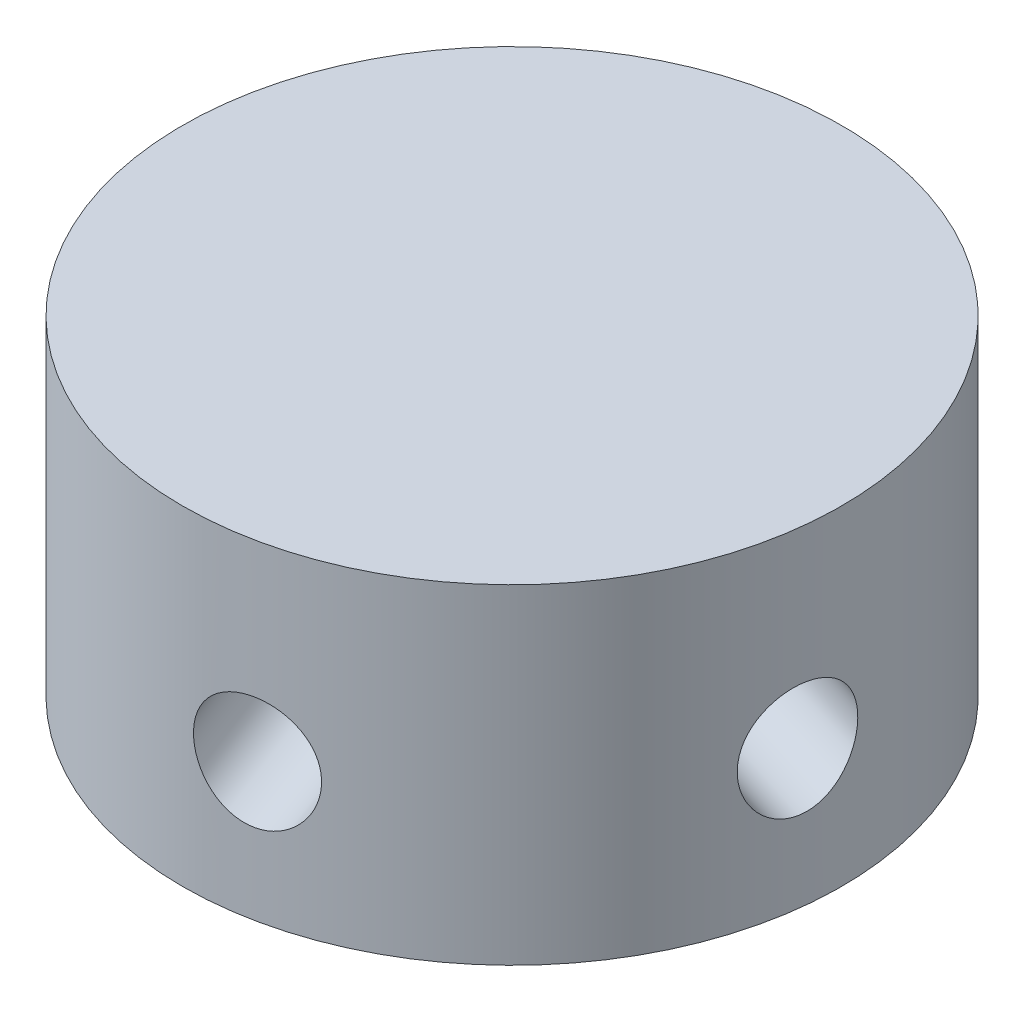
ISO-10303-21;
HEADER;
FILE_DESCRIPTION(('STEP AP214'),'2;1');
FILE_NAME('part.step','',(''),(''),'','','');
FILE_SCHEMA(('AUTOMOTIVE_DESIGN { 1 0 10303 214 1 1 1 1 }'));
ENDSEC;
DATA;
#1=APPLICATION_CONTEXT('core data for automotive mechanical design processes');
#2=APPLICATION_PROTOCOL_DEFINITION('international standard','automotive_design',2000,#1);
#3=PRODUCT_CONTEXT('',#1,'mechanical');
#4=PRODUCT('Part','Part','',(#3));
#5=PRODUCT_RELATED_PRODUCT_CATEGORY('part','',(#4));
#6=PRODUCT_DEFINITION_FORMATION('','',#4);
#7=PRODUCT_DEFINITION_CONTEXT('part definition',#1,'design');
#8=PRODUCT_DEFINITION('design','',#6,#7);
#9=PRODUCT_DEFINITION_SHAPE('','',#8);
#10=(LENGTH_UNIT() NAMED_UNIT(*) SI_UNIT(.MILLI.,.METRE.));
#11=(NAMED_UNIT(*) PLANE_ANGLE_UNIT() SI_UNIT($,.RADIAN.));
#12=(NAMED_UNIT(*) SI_UNIT($,.STERADIAN.) SOLID_ANGLE_UNIT());
#13=UNCERTAINTY_MEASURE_WITH_UNIT(LENGTH_MEASURE(1.E-05),#10,'distance_accuracy_value','');
#14=(GEOMETRIC_REPRESENTATION_CONTEXT(3) GLOBAL_UNCERTAINTY_ASSIGNED_CONTEXT((#13)) GLOBAL_UNIT_ASSIGNED_CONTEXT((#10,
#11,#12)) REPRESENTATION_CONTEXT('',''));
#15=CARTESIAN_POINT('',(0.,0.,0.));
#16=DIRECTION('',(0.,0.,1.));
#17=DIRECTION('',(1.,0.,0.));
#18=AXIS2_PLACEMENT_3D('',#15,#16,#17);
#19=CARTESIAN_POINT('',(0.,-7.,0.));
#20=DIRECTION('',(0.,1.,0.));
#21=DIRECTION('',(0.,0.,1.));
#22=AXIS2_PLACEMENT_3D('',#19,#20,#21);
#23=CYLINDRICAL_SURFACE('',#22,10.);
#24=CARTESIAN_POINT('',(-6.14049056453229,-2.80185333415317,-7.89267860912187));
#25=CARTESIAN_POINT('',(-6.14049484987098,-2.90311260530798,-7.8926771173948));
#26=CARTESIAN_POINT('',(-6.14742167349888,-3.00444630801447,-7.88730102143913));
#27=CARTESIAN_POINT('',(-6.17456960535942,-3.20428557507583,-7.86606467867558));
#28=CARTESIAN_POINT('',(-6.19481092788079,-3.30278660110905,-7.85018849025648));
#29=CARTESIAN_POINT('',(-6.24758606465871,-3.49402864719089,-7.80825195230282));
#30=CARTESIAN_POINT('',(-6.28010387497348,-3.58677698409684,-7.78220486030695));
#31=CARTESIAN_POINT('',(-6.35618053645921,-3.76405083087513,-7.72019225383376));
#32=CARTESIAN_POINT('',(-6.39973716809511,-3.84857798902742,-7.68422873308843));
#33=CARTESIAN_POINT('',(-6.49677419297166,-4.0074797372721,-7.60236653275902));
#34=CARTESIAN_POINT('',(-6.55032750757882,-4.08177226504704,-7.55639440638393));
#35=CARTESIAN_POINT('',(-6.66530484442865,-4.21673712753459,-7.45516985422077));
#36=CARTESIAN_POINT('',(-6.72672683044724,-4.27741297477979,-7.39991982818575));
#37=CARTESIAN_POINT('',(-6.85180731685719,-4.37969910254483,-7.28420196204808));
#38=CARTESIAN_POINT('',(-6.91517610130448,-4.42214746090229,-7.22416414907229));
#39=CARTESIAN_POINT('',(-7.04468208890332,-4.49037714811555,-7.09792925090644));
#40=CARTESIAN_POINT('',(-7.11081731209088,-4.51617018714301,-7.03173653070527));
#41=CARTESIAN_POINT('',(-7.23769609193848,-4.54827241317434,-6.9009669603053));
#42=CARTESIAN_POINT('',(-7.29842079861507,-4.55604960168239,-6.83672987422921));
#43=CARTESIAN_POINT('',(-7.4181232934973,-4.55610435520391,-6.70665707252628));
#44=CARTESIAN_POINT('',(-7.47710154986828,-4.54838611290343,-6.64082179409295));
#45=CARTESIAN_POINT('',(-7.58914518118781,-4.51849542512878,-6.51243718495664));
#46=CARTESIAN_POINT('',(-7.64235511011124,-4.49694768501525,-6.44986657890037));
#47=CARTESIAN_POINT('',(-7.74438908962325,-4.44093408992367,-6.3269915221727));
#48=CARTESIAN_POINT('',(-7.79321263189537,-4.4064667401441,-6.26668733461505));
#49=CARTESIAN_POINT('',(-7.88719536410919,-4.32455835210362,-6.1480141066026));
#50=CARTESIAN_POINT('',(-7.93217513840773,-4.27671851244057,-6.08977918037544));
#51=CARTESIAN_POINT('',(-8.01599488833277,-4.17027781305812,-5.97901830759517));
#52=CARTESIAN_POINT('',(-8.05483283696759,-4.11167341443825,-5.92649424758338));
#53=CARTESIAN_POINT('',(-8.12887873395592,-3.98039681645057,-5.82456968914417));
#54=CARTESIAN_POINT('',(-8.16355661281876,-3.90697856262923,-5.77574482124123));
#55=CARTESIAN_POINT('',(-8.22520624193827,-3.75167746614443,-5.68760774665095));
#56=CARTESIAN_POINT('',(-8.25217510749662,-3.66979147043527,-5.6482991017565));
#57=CARTESIAN_POINT('',(-8.29982334771064,-3.49389473062189,-5.57806967544514));
#58=CARTESIAN_POINT('',(-8.31995832537233,-3.39943899243557,-5.54789000950188));
#59=CARTESIAN_POINT('',(-8.35112569870438,-3.20580903167963,-5.50086365164089));
#60=CARTESIAN_POINT('',(-8.36215698226491,-3.10663423419308,-5.48401858869226));
#61=CARTESIAN_POINT('',(-8.3749751976751,-2.90510656540094,-5.4644245223265));
#62=CARTESIAN_POINT('',(-8.37665202559629,-2.80273004763596,-5.46184341196347));
#63=CARTESIAN_POINT('',(-8.3702179650445,-2.59900592417801,-5.47169881088784));
#64=CARTESIAN_POINT('',(-8.36210932299788,-2.49765808771846,-5.4841318734088));
#65=CARTESIAN_POINT('',(-8.33640829478898,-2.30289806320493,-5.52311622952816));
#66=CARTESIAN_POINT('',(-8.31917623870753,-2.20933107629193,-5.54913061701134));
#67=CARTESIAN_POINT('',(-8.27544405323076,-2.02912733106379,-5.61413850119806));
#68=CARTESIAN_POINT('',(-8.24894619094895,-1.94248888387195,-5.65312882289904));
#69=CARTESIAN_POINT('',(-8.18817869286306,-1.78234574650398,-5.74077006125955));
#70=CARTESIAN_POINT('',(-8.15427608455998,-1.70844589748726,-5.7889543827575));
#71=CARTESIAN_POINT('',(-8.07857486631454,-1.57180321214852,-5.89413382291653));
#72=CARTESIAN_POINT('',(-8.0367771178855,-1.5090591599609,-5.95112798013005));
#73=CARTESIAN_POINT('',(-7.94686706743979,-1.3976492449202,-6.07064896934821));
#74=CARTESIAN_POINT('',(-7.89889173560417,-1.34873573593262,-6.13304824928851));
#75=CARTESIAN_POINT('',(-7.79695939364072,-1.26473846475624,-6.26212247690848));
#76=CARTESIAN_POINT('',(-7.74300252241691,-1.229654381505,-6.32879732528523));
#77=CARTESIAN_POINT('',(-7.6304753269892,-1.1743255053056,-6.46402014793699));
#78=CARTESIAN_POINT('',(-7.57191849069269,-1.15403899904293,-6.53256228741066));
#79=CARTESIAN_POINT('',(-7.4515172201475,-1.12866503731343,-6.66957312480207));
#80=CARTESIAN_POINT('',(-7.38967276248538,-1.12357769010518,-6.73804182219324));
#81=CARTESIAN_POINT('',(-7.26433104139404,-1.12873521959118,-6.87298945856926));
#82=CARTESIAN_POINT('',(-7.20083212444676,-1.13899606231078,-6.93946625206363));
#83=CARTESIAN_POINT('',(-7.07414936240718,-1.17461642965421,-7.06856371471995));
#84=CARTESIAN_POINT('',(-7.01096551748161,-1.19997596226621,-7.13118438184174));
#85=CARTESIAN_POINT('',(-6.88696145187845,-1.26513227008347,-7.25101384908186));
#86=CARTESIAN_POINT('',(-6.82614108524058,-1.30492815217578,-7.30822298371172));
#87=CARTESIAN_POINT('',(-6.70896000255983,-1.39789330466096,-7.41594213852433));
#88=CARTESIAN_POINT('',(-6.65259901132912,-1.45106174898626,-7.46645257221381));
#89=CARTESIAN_POINT('',(-6.54642861262084,-1.56924203843328,-7.55971359766555));
#90=CARTESIAN_POINT('',(-6.49661184412477,-1.63424037731579,-7.60247292889534));
#91=CARTESIAN_POINT('',(-6.40528013313175,-1.77429957507827,-7.67958136416078));
#92=CARTESIAN_POINT('',(-6.36376672202771,-1.84936228587991,-7.71392891706904));
#93=CARTESIAN_POINT('',(-6.29041086863731,-2.00769020709796,-7.77386594225157));
#94=CARTESIAN_POINT('',(-6.25860722541265,-2.09098660894541,-7.79942032842891));
#95=CARTESIAN_POINT('',(-6.20598343870506,-2.26309586572625,-7.84135905208446));
#96=CARTESIAN_POINT('',(-6.18515318649743,-2.35190355902349,-7.85775183011779));
#97=CARTESIAN_POINT('',(-6.1602115596352,-2.50128545990081,-7.87730535840121));
#98=CARTESIAN_POINT('',(-6.15280973778735,-2.56100494517165,-7.88308144544808));
#99=CARTESIAN_POINT('',(-6.14294798907811,-2.68109191058814,-7.89076849470852));
#100=CARTESIAN_POINT('',(-6.14048800863267,-2.74145938370056,-7.89267949883093));
#101=CARTESIAN_POINT('',(-6.14049056453229,-2.80185333415317,-7.89267860912187));
#102=B_SPLINE_CURVE_WITH_KNOTS('',3,(#24,#25,#26,#27,#28,#29,#30,#31,#32,#33,#34,#35,#36,#37,
#38,#39,#40,#41,#42,#43,#44,#45,#46,#47,#48,#49,#50,#51,#52,#53,#54,#55,#56,#57,#58,#59,#60,#61,
#62,#63,#64,#65,#66,#67,#68,#69,#70,#71,#72,#73,#74,#75,#76,#77,#78,#79,#80,#81,#82,#83,#84,#85,
#86,#87,#88,#89,#90,#91,#92,#93,#94,#95,#96,#97,#98,#99,#100,#101),.UNSPECIFIED.,.T.,.F.,(4,2,2,
2,2,2,2,2,2,2,2,2,2,2,2,2,2,2,2,2,2,2,2,2,2,2,2,2,2,2,2,2,2,2,2,2,2,2,4),(0.,0.303551580729133,
0.607565085398305,0.911183631217716,1.21474117794247,1.52060630640841,1.82639244357147,
2.11601928881307,2.40544227824509,2.67029825789297,2.93508258362385,3.18867560467449,
3.44229797555118,3.70448486305142,3.96675810052679,4.24977540158885,4.53289846897012,
4.83504615345594,5.13723074292636,5.44296472274099,5.74862852930481,6.04303337870786,
6.33736624487386,6.6195178712115,6.90163872708666,7.17833137900766,7.45501760688407,
7.73092082959555,8.00682601746981,8.28301841666023,8.55921096197422,8.83538642339317,
9.11154482872539,9.38738989845224,9.66328579562635,9.94027013013495,10.2169988575706,
10.3980477403102,10.5790946599383),.UNSPECIFIED.);
#103=CARTESIAN_POINT('',(-6.14049056453229,-2.80185333415317,-7.89267860912187));
#104=VERTEX_POINT('',#103);
#105=EDGE_CURVE('E34',#104,#104,#102,.T.);
#106=ORIENTED_EDGE('',*,*,#105,.F.);
#107=EDGE_LOOP('',(#106));
#108=FACE_BOUND('',#107,.T.);
#109=CARTESIAN_POINT('',(5.60886748398926,-2.80185333415317,-8.27892538600561));
#110=CARTESIAN_POINT('',(5.60886474103002,-2.90311260530798,-8.27892900063588));
#111=CARTESIAN_POINT('',(5.6016112637211,-3.00444630801447,-8.28385549637072));
#112=CARTESIAN_POINT('',(5.5730251292465,-3.20428557507584,-8.30311232305832));
#113=CARTESIAN_POINT('',(5.55167106414886,-3.30278660110905,-8.31745695271329));
#114=CARTESIAN_POINT('',(5.49547863231234,-3.49402864719089,-8.35468998753138));
#115=CARTESIAN_POINT('',(5.460657819732,-3.58677698409685,-8.37756726884612));
#116=CARTESIAN_POINT('',(5.37817134497882,-3.76405083087514,-8.43075752422441));
#117=CARTESIAN_POINT('',(5.33050826483183,-3.84857798902742,-8.46106900348173));
#118=CARTESIAN_POINT('',(5.22266659599986,-4.0074797372721,-8.52805988721375));
#119=CARTESIAN_POINT('',(5.16239562132416,-4.08177226504703,-8.56478594772264));
#120=CARTESIAN_POINT('',(5.03059540032576,-4.21673712753459,-8.64285578629353));
#121=CARTESIAN_POINT('',(4.95906906553167,-4.27741297477979,-8.68419836935582));
#122=CARTESIAN_POINT('',(4.81036283892431,-4.37969910254483,-8.76739819382802));
#123=CARTESIAN_POINT('',(4.73368145436248,-4.42214746090229,-8.8091127846917));
#124=CARTESIAN_POINT('',(4.57360538083664,-4.49037714811555,-8.89327156928038));
#125=CARTESIAN_POINT('',(4.49021545506629,-4.51617018714301,-8.93571522880347));
#126=CARTESIAN_POINT('',(4.32663850380581,-4.54827241317434,-9.01597409955641));
#127=CARTESIAN_POINT('',(4.24678043816383,-4.55604960168239,-9.05387637627465));
#128=CARTESIAN_POINT('',(4.0860837473238,-4.55610435520391,-9.12752550781701));
#129=CARTESIAN_POINT('',(4.00524539325044,-4.54838611290343,-9.16327294299305));
#130=CARTESIAN_POINT('',(3.84852098795013,-4.51849542512878,-9.23015974262957));
#131=CARTESIAN_POINT('',(3.77257003302495,-4.49694768501525,-9.26143001164407));
#132=CARTESIAN_POINT('',(3.62417867596105,-4.44093408992367,-9.32049961202886));
#133=CARTESIAN_POINT('',(3.55173868113679,-4.4064667401441,-9.34829854126808));
#134=CARTESIAN_POINT('',(3.40983147289392,-4.32455835210362,-9.40100938692608));
#135=CARTESIAN_POINT('',(3.34054725216821,-4.27671851244057,-9.42579211250382));
#136=CARTESIAN_POINT('',(3.2093056751689,-4.17027781305812,-9.47128243986336));
#137=CARTESIAN_POINT('',(3.14735073947758,-4.11167341443825,-9.49198869683483));
#138=CARTESIAN_POINT('',(3.02753328347034,-3.98039681645057,-9.53091410896862));
#139=CARTESIAN_POINT('',(2.9703820207965,-3.90697856262923,-9.54880701770229));
#140=CARTESIAN_POINT('',(2.86750789858538,-3.75167746614443,-9.5802034453207));
#141=CARTESIAN_POINT('',(2.82178931793524,-3.66979147043527,-9.59370532134882));
#142=CARTESIAN_POINT('',(2.74027304842797,-3.49389473062189,-9.61731940445895));
#143=CARTESIAN_POINT('',(2.70534843019419,-3.39943899243557,-9.62714287650853));
#144=CARTESIAN_POINT('',(2.65099245808324,-3.20580903167963,-9.64225286624917));
#145=CARTESIAN_POINT('',(2.63156299710857,-3.10663423419308,-9.64753882964007));
#146=CARTESIAN_POINT('',(2.60896688621138,-2.90510656540094,-9.65367477743728));
#147=CARTESIAN_POINT('',(2.60599393605706,-2.80273004763597,-9.6544719285919));
#148=CARTESIAN_POINT('',(2.61735521147811,-2.59900592417802,-9.65139825913186));
#149=CARTESIAN_POINT('',(2.63168546479988,-2.49765808771846,-9.64752850988622));
#150=CARTESIAN_POINT('',(2.67670384521024,-2.30289806320494,-9.63513220808831));
#151=CARTESIAN_POINT('',(2.70676999612073,-2.20933107629194,-9.62678243669344));
#152=CARTESIAN_POINT('',(2.78211015650055,-2.02912733106379,-9.60527919770599));
#153=CARTESIAN_POINT('',(2.8273804457864,-1.94248888387195,-9.59212690513672));
#154=CARTESIAN_POINT('',(2.92951040623952,-1.78234574650398,-9.56141621216465));
#155=CARTESIAN_POINT('',(2.98581290130269,-1.70844589748726,-9.54406268982389));
#156=CARTESIAN_POINT('',(3.10923745617895,-1.57180321214852,-9.50456878738806));
#157=CARTESIAN_POINT('',(3.17635833537879,-1.5090591599609,-9.48242892953723));
#158=CARTESIAN_POINT('',(3.3178132845616,-1.3976492449202,-9.43385340703332));
#159=CARTESIAN_POINT('',(3.39198371920893,-1.34873573593262,-9.40750859300794));
#160=CARTESIAN_POINT('',(3.54623943041581,-1.26473846475624,-9.35045130483276));
#161=CARTESIAN_POINT('',(3.62632456960897,-1.229654381505,-9.31973893210225));
#162=CARTESIAN_POINT('',(3.78970193196027,-1.1743255053056,-9.25450535985705));
#163=CARTESIAN_POINT('',(3.87298443789996,-1.15403899904293,-9.21999518505181));
#164=CARTESIAN_POINT('',(4.04049552634692,-1.12866503731343,-9.14782544929708));
#165=CARTESIAN_POINT('',(4.12472411558854,-1.12357769010518,-9.11016586591736));
#166=CARTESIAN_POINT('',(4.291799666444,-1.12873521959118,-9.03265991830073));
#167=CARTESIAN_POINT('',(4.37464509854034,-1.13899606231078,-8.99281131848163));
#168=CARTESIAN_POINT('',(4.53657120800139,-1.17461642965421,-8.91222216203311));
#169=CARTESIAN_POINT('',(4.61565188337428,-1.19997596226621,-8.87148160493179));
#170=CARTESIAN_POINT('',(4.76793584268013,-1.26513227008347,-8.79057607209691));
#171=CARTESIAN_POINT('',(4.84113948985668,-1.30492815217578,-8.75041106091663));
#172=CARTESIAN_POINT('',(4.97979743993862,-1.39789330466096,-8.67225227810337));
#173=CARTESIAN_POINT('',(5.04525222115,-1.45106174898626,-8.63425837253185));
#174=CARTESIAN_POINT('',(5.16675718462268,-1.56924203843328,-8.56210356478011));
#175=CARTESIAN_POINT('',(5.22281795329132,-1.63424037731579,-8.52793836249927));
#176=CARTESIAN_POINT('',(5.32437548393402,-1.77429957507827,-8.46490456052165));
#177=CARTESIAN_POINT('',(5.36987029747184,-1.84936228587991,-8.43603693794135));
#178=CARTESIAN_POINT('',(5.44954200117354,-2.00769020709796,-8.3847929349397));
#179=CARTESIAN_POINT('',(5.48367353290688,-2.09098660894541,-8.36244261241858));
#180=CARTESIAN_POINT('',(5.5398212737256,-2.26309586572625,-8.32535419549017));
#181=CARTESIAN_POINT('',(5.56184863402365,-2.3519035590235,-8.31060909538934));
#182=CARTESIAN_POINT('',(5.58815253108195,-2.50128545990081,-8.29293057117458));
#183=CARTESIAN_POINT('',(5.59593320504688,-2.56100494517165,-8.2876759293322));
#184=CARTESIAN_POINT('',(5.60629147128251,-2.68109191058814,-8.28067227781828));
#185=CARTESIAN_POINT('',(5.60886911996927,-2.74145938370056,-8.27892323013583));
#186=CARTESIAN_POINT('',(5.60886748398926,-2.80185333415317,-8.27892538600561));
#187=B_SPLINE_CURVE_WITH_KNOTS('',3,(#109,#110,#111,#112,#113,#114,#115,#116,#117,#118,#119,
#120,#121,#122,#123,#124,#125,#126,#127,#128,#129,#130,#131,#132,#133,#134,#135,#136,#137,#138,
#139,#140,#141,#142,#143,#144,#145,#146,#147,#148,#149,#150,#151,#152,#153,#154,#155,#156,#157,
#158,#159,#160,#161,#162,#163,#164,#165,#166,#167,#168,#169,#170,#171,#172,#173,#174,#175,#176,
#177,#178,#179,#180,#181,#182,#183,#184,#185,#186),.UNSPECIFIED.,.T.,.F.,(4,2,2,2,2,2,2,2,2,2,2,
2,2,2,2,2,2,2,2,2,2,2,2,2,2,2,2,2,2,2,2,2,2,2,2,2,2,2,4),(0.,0.303551580729133,
0.607565085398305,0.911183631217717,1.21474117794247,1.52060630640841,1.82639244357147,
2.11601928881307,2.40544227824509,2.67029825789297,2.93508258362385,3.18867560467449,
3.44229797555118,3.70448486305142,3.96675810052679,4.24977540158885,4.53289846897012,
4.83504615345594,5.13723074292636,5.44296472274099,5.74862852930481,6.04303337870786,
6.33736624487386,6.6195178712115,6.90163872708666,7.17833137900766,7.45501760688407,
7.73092082959556,8.00682601746981,8.28301841666023,8.55921096197422,8.83538642339317,
9.11154482872539,9.38738989845224,9.66328579562635,9.94027013013495,10.2169988575706,
10.3980477403102,10.5790946599383),.UNSPECIFIED.);
#188=CARTESIAN_POINT('',(5.60886748398926,-2.80185333415317,-8.27892538600561));
#189=VERTEX_POINT('',#188);
#190=EDGE_CURVE('E89',#189,#189,#187,.T.);
#191=ORIENTED_EDGE('',*,*,#190,.F.);
#192=EDGE_LOOP('',(#191));
#193=FACE_BOUND('',#192,.T.);
#194=CARTESIAN_POINT('',(9.92716226766536,-4.55517624671581,1.20476110139782));
#195=CARTESIAN_POINT('',(9.93759733292305,-4.55815622649319,1.11876470154856));
#196=CARTESIAN_POINT('',(9.94694247296546,-4.55369712601266,1.03232700667402));
#197=CARTESIAN_POINT('',(9.96321903376517,-4.53008356025253,0.861206414228923));
#198=CARTESIAN_POINT('',(9.97014816779366,-4.51091522742824,0.776525250096444));
#199=CARTESIAN_POINT('',(9.98162255807638,-4.45882309306678,0.61158314561609));
#200=CARTESIAN_POINT('',(9.98617353195352,-4.42593262849761,0.531312022651404));
#201=CARTESIAN_POINT('',(9.99319024522215,-4.34774705512916,0.376995777821501));
#202=CARTESIAN_POINT('',(9.99565589465482,-4.30245141129443,0.30295092467541));
#203=CARTESIAN_POINT('',(9.99898921032584,-4.19897933879916,0.159840225874142));
#204=CARTESIAN_POINT('',(9.99978828840905,-4.14035642897913,0.0910964174944591));
#205=CARTESIAN_POINT('',(10.0001373349712,-4.0132348009273,-0.0365522496687653));
#206=CARTESIAN_POINT('',(9.99968687777297,-3.94473272471153,-0.0954537482413401));
#207=CARTESIAN_POINT('',(9.9980310340233,-3.79372225422006,-0.206702876823501));
#208=CARTESIAN_POINT('',(9.9967667841341,-3.71052599866569,-0.25811732147479));
#209=CARTESIAN_POINT('',(9.99407696634846,-3.53697847646171,-0.346999318196151));
#210=CARTESIAN_POINT('',(9.99265134622098,-3.4466248960425,-0.384462337650199));
#211=CARTESIAN_POINT('',(9.99010488200058,-3.25669631917349,-0.445872771632775));
#212=CARTESIAN_POINT('',(9.98900151976161,-3.15688749367757,-0.469101879100419));
#213=CARTESIAN_POINT('',(9.98758943790602,-2.95475738874918,-0.498272771841489));
#214=CARTESIAN_POINT('',(9.98728067771086,-2.85243623788491,-0.504215439896358));
#215=CARTESIAN_POINT('',(9.9875791897699,-2.64958431456438,-0.498268108615026));
#216=CARTESIAN_POINT('',(9.98817497287104,-2.54904722451843,-0.486601782726115));
#217=CARTESIAN_POINT('',(9.9900807702515,-2.35159822781051,-0.445759466697659));
#218=CARTESIAN_POINT('',(9.99139058669743,-2.25468532495845,-0.416588326297531));
#219=CARTESIAN_POINT('',(9.99418066476258,-2.07181493275742,-0.342981087338452));
#220=CARTESIAN_POINT('',(9.99565083083889,-1.98556252239806,-0.299276874136405));
#221=CARTESIAN_POINT('',(9.99817796262187,-1.82197399796506,-0.197523092692519));
#222=CARTESIAN_POINT('',(9.99923500583166,-1.74463621340172,-0.13947621851604));
#223=CARTESIAN_POINT('',(10.0001846941871,-1.60367921453023,-0.0128951213293563));
#224=CARTESIAN_POINT('',(10.0001147903363,-1.53969011724363,0.0552274891447694));
#225=CARTESIAN_POINT('',(9.99824017956867,-1.42414388208328,0.201284705157195));
#226=CARTESIAN_POINT('',(9.9964355858994,-1.37258593292874,0.279218669881971));
#227=CARTESIAN_POINT('',(9.99056696460379,-1.28381972761827,0.441704325047936));
#228=CARTESIAN_POINT('',(9.9865272676749,-1.24646413154236,0.526176470084306));
#229=CARTESIAN_POINT('',(9.97584956992457,-1.18631756581786,0.700000921190993));
#230=CARTESIAN_POINT('',(9.96921158088991,-1.1635265301005,0.789353205121687));
#231=CARTESIAN_POINT('',(9.95322346211486,-1.13310117923188,0.970357554567299));
#232=CARTESIAN_POINT('',(9.94387355223949,-1.12546563576461,1.06200943309589));
#233=CARTESIAN_POINT('',(9.92262227910084,-1.12554227700687,1.24501102267329));
#234=CARTESIAN_POINT('',(9.91072090097041,-1.13325455114871,1.33636073195823));
#235=CARTESIAN_POINT('',(9.88479880609176,-1.16384229749555,1.51625202428275));
#236=CARTESIAN_POINT('',(9.8707764168677,-1.1867297843942,1.6047913239827));
#237=CARTESIAN_POINT('',(9.84132271627415,-1.24708623784334,1.77650247665508));
#238=CARTESIAN_POINT('',(9.82589142133141,-1.28455503440369,1.85967439218775));
#239=CARTESIAN_POINT('',(9.79454290653,-1.3730472522044,2.01828341795896));
#240=CARTESIAN_POINT('',(9.77862604187545,-1.42406096597627,2.09372601424868));
#241=CARTESIAN_POINT('',(9.74733520696948,-1.53825805250186,2.23488084183876));
#242=CARTESIAN_POINT('',(9.7319612177713,-1.60144100004235,2.30059341298047));
#243=CARTESIAN_POINT('',(9.70282411676594,-1.73817942133627,2.42054193721004));
#244=CARTESIAN_POINT('',(9.6890605724322,-1.81173209827547,2.47478097498792));
#245=CARTESIAN_POINT('',(9.66411346237586,-1.96711260425739,2.57047965212234));
#246=CARTESIAN_POINT('',(9.65292991193587,-2.04894048231417,2.61193921578009));
#247=CARTESIAN_POINT('',(9.63383395446498,-2.21929169893551,2.68152277071237));
#248=CARTESIAN_POINT('',(9.62595159290607,-2.30786821561446,2.70952460301551));
#249=CARTESIAN_POINT('',(9.61411462997497,-2.48857010245244,2.7512310000393));
#250=CARTESIAN_POINT('',(9.61016056846264,-2.58069595858475,2.76493359965276));
#251=CARTESIAN_POINT('',(9.60632286199532,-2.76875264868655,2.77823920657476));
#252=CARTESIAN_POINT('',(9.60656197419399,-2.86471584250245,2.77741698787133));
#253=CARTESIAN_POINT('',(9.61129453203855,-3.05526117304809,2.76099355196606));
#254=CARTESIAN_POINT('',(9.61578900989037,-3.14984296904566,2.74538874901524));
#255=CARTESIAN_POINT('',(9.62891948662646,-3.33935657690068,2.69898411435998));
#256=CARTESIAN_POINT('',(9.63772932473139,-3.43412001087822,2.66754475516235));
#257=CARTESIAN_POINT('',(9.65885023979024,-3.61705672125594,2.59002284863815));
#258=CARTESIAN_POINT('',(9.67116214767477,-3.70522842736983,2.54393682581586));
#259=CARTESIAN_POINT('',(9.69871877776086,-3.87456105535657,2.4367975014589));
#260=CARTESIAN_POINT('',(9.7140275741255,-3.95549917871989,2.37540728946565));
#261=CARTESIAN_POINT('',(9.74624901136707,-4.10521606951835,2.23952881163659));
#262=CARTESIAN_POINT('',(9.7631617944611,-4.17399375719983,2.16503938386075));
#263=CARTESIAN_POINT('',(9.79675229921839,-4.29453548271792,2.00746213623223));
#264=CARTESIAN_POINT('',(9.81341808633477,-4.34680349059918,1.92475834861463));
#265=CARTESIAN_POINT('',(9.84590184293491,-4.43501128395859,1.75099193526312));
#266=CARTESIAN_POINT('',(9.86172133776395,-4.47098138356953,1.65994520995519));
#267=CARTESIAN_POINT('',(9.88589211006985,-4.51470673753603,1.50754479884505));
#268=CARTESIAN_POINT('',(9.89482419372251,-4.52798285176991,1.44781711468795));
#269=CARTESIAN_POINT('',(9.91174257590944,-4.54715592642268,1.32705455818726));
#270=CARTESIAN_POINT('',(9.91972895136604,-4.5530534873747,1.26601979263704));
#271=CARTESIAN_POINT('',(9.92716226766536,-4.55517624671581,1.20476110139782));
#272=B_SPLINE_CURVE_WITH_KNOTS('',3,(#194,#195,#196,#197,#198,#199,#200,#201,#202,#203,#204,
#205,#206,#207,#208,#209,#210,#211,#212,#213,#214,#215,#216,#217,#218,#219,#220,#221,#222,#223,
#224,#225,#226,#227,#228,#229,#230,#231,#232,#233,#234,#235,#236,#237,#238,#239,#240,#241,#242,
#243,#244,#245,#246,#247,#248,#249,#250,#251,#252,#253,#254,#255,#256,#257,#258,#259,#260,#261,
#262,#263,#264,#265,#266,#267,#268,#269,#270,#271),.UNSPECIFIED.,.T.,.F.,(4,2,2,2,2,2,2,2,2,2,2,
2,2,2,2,2,2,2,2,2,2,2,2,2,2,2,2,2,2,2,2,2,2,2,2,2,2,2,4),(0.,0.259799683229375,
0.519844601333052,0.779261403602595,1.03868939628262,1.30859904487898,1.57860065445836,
1.87073764071155,2.162969455412,2.46894161662314,2.77489815221688,3.07700092801512,
3.37902004433016,3.66768679633482,3.95629936755057,4.23534105186774,4.51436452045223,
4.79040873398835,5.0664516953045,5.34247228309215,5.61849447926699,5.89473547227449,
6.17097324493736,6.44701357342665,6.72304425835819,6.999000637119,7.2749586504666,
7.55337638350161,7.83183237374117,8.11845355974561,8.4051442880468,8.70447341168249,
9.00387361599764,9.31055910111332,9.61727180389319,9.91343136064924,10.2090377758234,
10.3941185943434,10.5791843483389),.UNSPECIFIED.);
#273=CARTESIAN_POINT('',(9.92716226766536,-4.55517624671581,1.20476110139782));
#274=VERTEX_POINT('',#273);
#275=EDGE_CURVE('E93',#274,#274,#272,.T.);
#276=ORIENTED_EDGE('',*,*,#275,.F.);
#277=EDGE_LOOP('',(#276));
#278=FACE_BOUND('',#277,.T.);
#279=CARTESIAN_POINT('',(1.88425206211219,-1.12797580944576,9.82087542770124));
#280=CARTESIAN_POINT('',(1.79397796352734,-1.13299817941267,9.83819399668988));
#281=CARTESIAN_POINT('',(1.7038209740874,-1.14567644738588,9.85418955752939));
#282=CARTESIAN_POINT('',(1.52637593194951,-1.18604733135926,9.8832324623693));
#283=CARTESIAN_POINT('',(1.43909074461173,-1.21375448783806,9.89627693383675));
#284=CARTESIAN_POINT('',(1.27002899329948,-1.28345606009991,9.91939035861277));
#285=CARTESIAN_POINT('',(1.18825060997918,-1.32544572918644,9.92946029841206));
#286=CARTESIAN_POINT('',(1.03262303908419,-1.42257904933871,9.94685023024041));
#287=CARTESIAN_POINT('',(0.958772056787999,-1.4777197139426,9.95417084564366));
#288=CARTESIAN_POINT('',(0.821218013151381,-1.59959448866735,9.9664625614339));
#289=CARTESIAN_POINT('',(0.757508056143502,-1.66632065580148,9.97143526291232));
#290=CARTESIAN_POINT('',(0.642026134066624,-1.80950033773246,9.97953724642271));
#291=CARTESIAN_POINT('',(0.590254312345219,-1.88595396931509,9.98266650632018));
#292=CARTESIAN_POINT('',(0.499857369153589,-2.04674602405465,9.98760281190504));
#293=CARTESIAN_POINT('',(0.461290691081435,-2.13111744565325,9.98940401939627));
#294=CARTESIAN_POINT('',(0.398517854253216,-2.30504750229437,9.99210566539118));
#295=CARTESIAN_POINT('',(0.374312932696487,-2.39460658350069,9.99300602629566));
#296=CARTESIAN_POINT('',(0.340275298813555,-2.5784264919362,9.99422399629749));
#297=CARTESIAN_POINT('',(0.330766767663928,-2.67274722215466,9.99452849916559));
#298=CARTESIAN_POINT('',(0.327037980106658,-2.86168568913454,9.99465089673687));
#299=CARTESIAN_POINT('',(0.332820986209969,-2.95630348497445,9.99446868759799));
#300=CARTESIAN_POINT('',(0.359754766671757,-3.14733551041188,9.99353619372746));
#301=CARTESIAN_POINT('',(0.381534220879904,-3.24366097928055,9.99276261508605));
#302=CARTESIAN_POINT('',(0.440343669179684,-3.43153889298823,9.99034316782993));
#303=CARTESIAN_POINT('',(0.477377889685958,-3.52309000714111,9.98869705743934));
#304=CARTESIAN_POINT('',(0.567278258663954,-3.70222471606751,9.98400170384322));
#305=CARTESIAN_POINT('',(0.620669383153185,-3.78954439896984,9.98090378614786));
#306=CARTESIAN_POINT('',(0.741387612834615,-3.95388315381892,9.972662329664));
#307=CARTESIAN_POINT('',(0.808715753351292,-4.03090145981802,9.96751863887714));
#308=CARTESIAN_POINT('',(0.954726680874589,-4.1710919252199,9.95458646748242));
#309=CARTESIAN_POINT('',(1.03325845796322,-4.23442380612059,9.94683154334535));
#310=CARTESIAN_POINT('',(1.20016515913998,-4.34581070807782,9.92807270753976));
#311=CARTESIAN_POINT('',(1.28853449306495,-4.39387434603178,9.91707063524359));
#312=CARTESIAN_POINT('',(1.46562813631754,-4.46949564329076,9.89238756709442));
#313=CARTESIAN_POINT('',(1.55385824067059,-4.49829142810565,9.87895991239162));
#314=CARTESIAN_POINT('',(1.73358206426232,-4.53925733510558,9.84900846431078));
#315=CARTESIAN_POINT('',(1.82507384017884,-4.551437192731,9.83248649038561));
#316=CARTESIAN_POINT('',(2.00112822858455,-4.55825554910374,9.79810766310484));
#317=CARTESIAN_POINT('',(2.08568295193661,-4.55417028222142,9.78045100097735));
#318=CARTESIAN_POINT('',(2.2524214623541,-4.53149488706399,9.74340236078445));
#319=CARTESIAN_POINT('',(2.33460546600626,-4.51290608819781,9.72401054190953));
#320=CARTESIAN_POINT('',(2.49331152197482,-4.46240569049193,9.68452413797268));
#321=CARTESIAN_POINT('',(2.56989355090651,-4.43067145104624,9.66444205548597));
#322=CARTESIAN_POINT('',(2.7168238368601,-4.35516040206012,9.62417166523441));
#323=CARTESIAN_POINT('',(2.78717077645522,-4.31138105546237,9.60398333597051));
#324=CARTESIAN_POINT('',(2.92408418288135,-4.21045875073771,9.56321737660709));
#325=CARTESIAN_POINT('',(2.99020561261263,-4.15269560196409,9.54268330920858));
#326=CARTESIAN_POINT('',(3.11281411310429,-4.02720431691575,9.50339634605955));
#327=CARTESIAN_POINT('',(3.16929757332565,-3.9594724638236,9.48464411897582));
#328=CARTESIAN_POINT('',(3.27592351694458,-3.81000081064346,9.44837322131307));
#329=CARTESIAN_POINT('',(3.32517424978051,-3.7275692960801,9.43107958288188));
#330=CARTESIAN_POINT('',(3.4104817859734,-3.55543289944692,9.40056765711808));
#331=CARTESIAN_POINT('',(3.44653442682943,-3.46572573361221,9.38735065570861));
#332=CARTESIAN_POINT('',(3.50609912444722,-3.27679773906975,9.36527289189275));
#333=CARTESIAN_POINT('',(3.52891103691489,-3.17732616882531,9.35665700041914));
#334=CARTESIAN_POINT('',(3.55840495265489,-2.97567515645113,9.34548063325825));
#335=CARTESIAN_POINT('',(3.56508744855359,-2.87349579711934,9.34291997263151));
#336=CARTESIAN_POINT('',(3.56180406152239,-2.67052196990983,9.34417229402892));
#337=CARTESIAN_POINT('',(3.55201642263741,-2.56972442482577,9.34791703761687));
#338=CARTESIAN_POINT('',(3.51596163067956,-2.37154506419716,9.36153742454118));
#339=CARTESIAN_POINT('',(3.48969902833879,-2.2741623132552,9.3714113748536));
#340=CARTESIAN_POINT('',(3.42256687290569,-2.09015205385105,9.39612932250519));
#341=CARTESIAN_POINT('',(3.38238939580159,-2.00324003894115,9.41073603060885));
#342=CARTESIAN_POINT('',(3.28814380823967,-1.83818429601899,9.44407732861052));
#343=CARTESIAN_POINT('',(3.23407880116544,-1.76003861463188,9.46281099614256));
#344=CARTESIAN_POINT('',(3.11549480108507,-1.61744050813242,9.5024973472681));
#345=CARTESIAN_POINT('',(3.05139414177375,-1.55261261217993,9.52335282955628));
#346=CARTESIAN_POINT('',(2.9131679218755,-1.43527833961059,9.56653976803455));
#347=CARTESIAN_POINT('',(2.83904104192768,-1.38277358710046,9.58887141827704));
#348=CARTESIAN_POINT('',(2.68365531117102,-1.2920740764786,9.63350683839952));
#349=CARTESIAN_POINT('',(2.60248313343967,-1.25372938554753,9.65580825225482));
#350=CARTESIAN_POINT('',(2.43458312517793,-1.19159565912095,9.69950015547053));
#351=CARTESIAN_POINT('',(2.34786081338182,-1.16779240544502,9.72089151554759));
#352=CARTESIAN_POINT('',(2.19800432674179,-1.14021889639142,9.75565446030613));
#353=CARTESIAN_POINT('',(2.13566406096635,-1.1325680386452,9.76949565955588));
#354=CARTESIAN_POINT('',(2.01028088212708,-1.12469438471043,9.7960644021668));
#355=CARTESIAN_POINT('',(1.94723796710681,-1.12447160920956,9.80879194242626));
#356=CARTESIAN_POINT('',(1.88425206211219,-1.12797580944576,9.82087542770124));
#357=B_SPLINE_CURVE_WITH_KNOTS('',3,(#279,#280,#281,#282,#283,#284,#285,#286,#287,#288,#289,
#290,#291,#292,#293,#294,#295,#296,#297,#298,#299,#300,#301,#302,#303,#304,#305,#306,#307,#308,
#309,#310,#311,#312,#313,#314,#315,#316,#317,#318,#319,#320,#321,#322,#323,#324,#325,#326,#327,
#328,#329,#330,#331,#332,#333,#334,#335,#336,#337,#338,#339,#340,#341,#342,#343,#344,#345,#346,
#347,#348,#349,#350,#351,#352,#353,#354,#355,#356),.UNSPECIFIED.,.T.,.F.,(4,2,2,2,2,2,2,2,2,2,2,
2,2,2,2,2,2,2,2,2,2,2,2,2,2,2,2,2,2,2,2,2,2,2,2,2,2,2,4),(0.,0.27593969888326,0.55214684739258,
0.828262289868468,1.10431508884445,1.38017936881391,1.65604696106128,1.93312016845874,
2.21021724097585,2.49334360325347,2.77653037655254,3.07148608785842,3.36652357324658,
3.67225019633702,3.97799953877569,4.27996087779385,4.5817514956833,4.86157131298817,
5.14122711050627,5.39938932116727,5.6575278711892,5.91229152278962,6.16710887631643,
6.43647225055479,6.70593631217485,6.99735794562805,7.28887141052765,7.59465258889899,
7.90042442795053,8.20290836347253,8.50530878332492,8.79442993950001,9.08348654319853,
9.36270706065679,9.64196435684765,9.91817367630635,10.1941124925202,10.3866401779295,
10.5791683995407),.UNSPECIFIED.);
#358=CARTESIAN_POINT('',(1.88425206211219,-1.12797580944576,9.82087542770124));
#359=VERTEX_POINT('',#358);
#360=EDGE_CURVE('E58',#359,#359,#357,.T.);
#361=ORIENTED_EDGE('',*,*,#360,.F.);
#362=EDGE_LOOP('',(#361));
#363=FACE_BOUND('',#362,.T.);
#364=CARTESIAN_POINT('',(-9.40389936046821,-2.80185333415317,3.40098174328909));
#365=CARTESIAN_POINT('',(-9.40389926599394,-2.90311260530799,3.40098627985739));
#366=CARTESIAN_POINT('',(-9.40092680112113,-3.00444630801447,3.40923538561962));
#367=CARTESIAN_POINT('',(-9.38911901126061,-3.20428557507584,3.44161699393183));
#368=CARTESIAN_POINT('',(-9.38027477145843,-3.30278660110905,3.46577364764161));
#369=CARTESIAN_POINT('',(-9.35669916791158,-3.4940286471909,3.52892488828555));
#370=CARTESIAN_POINT('',(-9.3419754673455,-3.58677698409685,3.56790015776184));
#371=CARTESIAN_POINT('',(-9.30650695514112,-3.76405083087514,3.65941631167153));
#372=CARTESIAN_POINT('',(-9.28576335378058,-3.84857798902742,3.71195446910458));
#373=CARTESIAN_POINT('',(-9.23789386448948,-4.0074797372721,3.82953897503402));
#374=CARTESIAN_POINT('',(-9.21072065845122,-4.08177226504704,3.89467737217783));
#375=CARTESIAN_POINT('',(-9.14998033956196,-4.21673712753459,4.03530742448153));
#376=CARTESIAN_POINT('',(-9.11641487978388,-4.27741297477979,4.11079640151278));
#377=CARTESIAN_POINT('',(-9.04501264510724,-4.37969910254483,4.26551380036367));
#378=CARTESIAN_POINT('',(-9.0074953231596,-4.42214746090229,4.3443338002566));
#379=CARTESIAN_POINT('',(-8.92745835171646,-4.49037714811555,4.50651004247816));
#380=CARTESIAN_POINT('',(-8.88494224172958,-4.51617018714301,4.58986305289338));
#381=CARTESIAN_POINT('',(-8.79978068886603,-4.54827241317434,4.75094196284773));
#382=CARTESIAN_POINT('',(-8.75745255590705,-4.55604960168239,4.82854494209925));
#383=CARTESIAN_POINT('',(-8.6707360754424,-4.55610435520391,4.98258348610594));
#384=CARTESIAN_POINT('',(-8.62634828840351,-4.54838611290343,5.05901936101259));
#385=CARTESIAN_POINT('',(-8.53887065548164,-4.51849542512878,5.20525221272771));
#386=CARTESIAN_POINT('',(-8.4958052451701,-4.49694768501525,5.27519324298167));
#387=CARTESIAN_POINT('',(-8.41047435545203,-4.44093408992367,5.41020380479373));
#388=CARTESIAN_POINT('',(-8.36820896920311,-4.4064667401441,5.47527277160753));
#389=CARTESIAN_POINT('',(-8.28438628382396,-4.32455835210362,5.60132770573188));
#390=CARTESIAN_POINT('',(-8.24290109242104,-4.27671851244057,5.66210159505036));
#391=CARTESIAN_POINT('',(-8.16346296980393,-4.17027781305812,5.7760459064117));
#392=CARTESIAN_POINT('',(-8.12551120642225,-4.11167341443825,5.8292138176976));
#393=CARTESIAN_POINT('',(-8.05145663148127,-3.98039681645057,5.93113207123515));
#394=CARTESIAN_POINT('',(-8.01573747660242,-3.90697856262923,5.97920040782907));
#395=CARTESIAN_POINT('',(-7.95096492058098,-3.75167746614443,6.06506854321324));
#396=CARTESIAN_POINT('',(-7.92191401548393,-3.66979147043527,6.10286449783784));
#397=CARTESIAN_POINT('',(-7.86984597793303,-3.49389473062189,6.16988275341879));
#398=CARTESIAN_POINT('',(-7.8473654602569,-3.39943899243557,6.19835828479043));
#399=CARTESIAN_POINT('',(-7.81227198420521,-3.20580903167963,6.24253216205628));
#400=CARTESIAN_POINT('',(-7.79966023141049,-3.10663423419308,6.25822894689206));
#401=CARTESIAN_POINT('',(-7.78498621331192,-2.90510656540094,6.27647469368113));
#402=CARTESIAN_POINT('',(-7.78304959980618,-2.80273004763597,6.27886705876881));
#403=CARTESIAN_POINT('',(-7.79043440712055,-2.59900592417801,6.26970241780082));
#404=CARTESIAN_POINT('',(-7.7997532440549,-2.49765808771846,6.25814861333298));
#405=CARTESIAN_POINT('',(-7.82888751548634,-2.30289806320493,6.22165865442377));
#406=CARTESIAN_POINT('',(-7.84830367004244,-2.20933107629194,6.19723110736778));
#407=CARTESIAN_POINT('',(-7.89661585339531,-2.02912733106379,6.13555078641622));
#408=CARTESIAN_POINT('',(-7.92550956316178,-1.94248888387195,6.09830114980346));
#409=CARTESIAN_POINT('',(-7.99008314438654,-1.78234574650398,6.01342519270846));
#410=CARTESIAN_POINT('',(-8.02543267521113,-1.70844589748726,5.96629212195713));
#411=CARTESIAN_POINT('',(-8.10207130422193,-1.57180321214852,5.86179375058533));
#412=CARTESIAN_POINT('',(-8.14335975423941,-1.5090591599609,5.80442956641638));
#413=CARTESIAN_POINT('',(-8.22924723631655,-1.3976492449202,5.68198601020664));
#414=CARTESIAN_POINT('',(-8.27376728526792,-1.34873573593262,5.61707632030464));
#415=CARTESIAN_POINT('',(-8.3650253445885,-1.26473846475624,5.48024677238868));
#416=CARTESIAN_POINT('',(-8.41176330343875,-1.229654381505,5.40832707716659));
#417=CARTESIAN_POINT('',(-8.50559503435702,-1.1743255053056,5.2595212044679));
#418=CARTESIAN_POINT('',(-8.55268742519181,-1.15403899904293,5.1826496578063));
#419=CARTESIAN_POINT('',(-8.64578643615317,-1.12866503731343,5.02580256771659));
#420=CARTESIAN_POINT('',(-8.69179304854379,-1.12357769010518,4.9458270021837));
#421=CARTESIAN_POINT('',(-8.7814031555564,-1.12873521959118,4.78491882858522));
#422=CARTESIAN_POINT('',(-8.82500409873051,-1.13899606231078,4.7039853109235));
#423=CARTESIAN_POINT('',(-8.90863595546239,-1.17461642965421,4.54360953469201));
#424=CARTESIAN_POINT('',(-8.94866686713137,-1.19997596226621,4.46416727691123));
#425=CARTESIAN_POINT('',(-9.0243120991513,-1.26513227008347,4.30920306046816));
#426=CARTESIAN_POINT('',(-9.05992669253742,-1.30492815217578,4.23368085961965));
#427=CARTESIAN_POINT('',(-9.12616275068414,-1.39789330466096,4.0889479778928));
#428=CARTESIAN_POINT('',(-9.15678452367531,-1.45106174898626,4.01973690751468));
#429=CARTESIAN_POINT('',(-9.21267257214715,-1.56924203843328,3.88994361620809));
#430=CARTESIAN_POINT('',(-9.23794488467553,-1.63424037731579,3.82935169389102));
#431=CARTESIAN_POINT('',(-9.28305631367386,-1.77429957507827,3.71866225810005));
#432=CARTESIAN_POINT('',(-9.30289442816043,-1.84936228587991,3.66856668039206));
#433=CARTESIAN_POINT('',(-9.33722972119311,-2.00769020709796,3.58027955864305));
#434=CARTESIAN_POINT('',(-9.35170552044754,-2.09098660894541,3.54213575690269));
#435=CARTESIAN_POINT('',(-9.37532997246424,-2.26309586572625,3.47912778331035));
#436=CARTESIAN_POINT('',(-9.38448352890375,-2.3519035590235,3.4542513892149));
#437=CARTESIAN_POINT('',(-9.39537265282647,-2.50128545990081,3.424488119921));
#438=CARTESIAN_POINT('',(-9.39857874931076,-2.56100494517165,3.41566365996168));
#439=CARTESIAN_POINT('',(-9.40284211965557,-2.68109191058814,3.40390915073162));
#440=CARTESIAN_POINT('',(-9.40389941681539,-2.74145938370056,3.40097903754888));
#441=CARTESIAN_POINT('',(-9.40389936046821,-2.80185333415317,3.40098174328909));
#442=B_SPLINE_CURVE_WITH_KNOTS('',3,(#364,#365,#366,#367,#368,#369,#370,#371,#372,#373,#374,
#375,#376,#377,#378,#379,#380,#381,#382,#383,#384,#385,#386,#387,#388,#389,#390,#391,#392,#393,
#394,#395,#396,#397,#398,#399,#400,#401,#402,#403,#404,#405,#406,#407,#408,#409,#410,#411,#412,
#413,#414,#415,#416,#417,#418,#419,#420,#421,#422,#423,#424,#425,#426,#427,#428,#429,#430,#431,
#432,#433,#434,#435,#436,#437,#438,#439,#440,#441),.UNSPECIFIED.,.T.,.F.,(4,2,2,2,2,2,2,2,2,2,2,
2,2,2,2,2,2,2,2,2,2,2,2,2,2,2,2,2,2,2,2,2,2,2,2,2,2,2,4),(0.,0.303551580729134,
0.607565085398304,0.911183631217715,1.21474117794247,1.52060630640841,1.82639244357147,
2.11601928881307,2.40544227824509,2.67029825789297,2.93508258362385,3.18867560467449,
3.44229797555118,3.70448486305142,3.96675810052679,4.24977540158885,4.53289846897012,
4.83504615345594,5.13723074292636,5.44296472274099,5.74862852930481,6.04303337870786,
6.33736624487386,6.6195178712115,6.90163872708666,7.17833137900765,7.45501760688407,
7.73092082959555,8.00682601746981,8.28301841666023,8.55921096197422,8.83538642339317,
9.11154482872539,9.38738989845224,9.66328579562635,9.94027013013495,10.2169988575706,
10.3980477403102,10.5790946599383),.UNSPECIFIED.);
#443=CARTESIAN_POINT('',(-9.40389936046821,-2.80185333415317,3.40098174328909));
#444=VERTEX_POINT('',#443);
#445=EDGE_CURVE('E47',#444,#444,#442,.T.);
#446=ORIENTED_EDGE('',*,*,#445,.F.);
#447=EDGE_LOOP('',(#446));
#448=FACE_BOUND('',#447,.T.);
#449=CARTESIAN_POINT('',(0.,-7.,0.));
#450=DIRECTION('',(0.,1.,0.));
#451=DIRECTION('',(0.,0.,1.));
#452=AXIS2_PLACEMENT_3D('',#449,#450,#451);
#453=CIRCLE('',#452,10.);
#454=CARTESIAN_POINT('',(0.,-7.,10.));
#455=VERTEX_POINT('',#454);
#456=EDGE_CURVE('E10',#455,#455,#453,.T.);
#457=ORIENTED_EDGE('',*,*,#456,.T.);
#458=EDGE_LOOP('',(#457));
#459=FACE_BOUND('',#458,.T.);
#460=CARTESIAN_POINT('',(0.,3.,0.));
#461=DIRECTION('',(0.,1.,0.));
#462=DIRECTION('',(0.,0.,1.));
#463=AXIS2_PLACEMENT_3D('',#460,#461,#462);
#464=CIRCLE('',#463,10.);
#465=CARTESIAN_POINT('',(0.,3.,10.));
#466=VERTEX_POINT('',#465);
#467=EDGE_CURVE('E42',#466,#466,#464,.T.);
#468=ORIENTED_EDGE('',*,*,#467,.F.);
#469=EDGE_LOOP('',(#468));
#470=FACE_BOUND('',#469,.T.);
#471=ADVANCED_FACE('F30',(#108,#193,#278,#363,#448,#459,#470),#23,.T.);
#472=CARTESIAN_POINT('',(0.,-7.,0.));
#473=DIRECTION('',(0.,1.,0.));
#474=DIRECTION('',(0.,0.,1.));
#475=AXIS2_PLACEMENT_3D('',#472,#473,#474);
#476=PLANE('',#475);
#477=ORIENTED_EDGE('',*,*,#456,.F.);
#478=EDGE_LOOP('',(#477));
#479=FACE_BOUND('',#478,.T.);
#480=ADVANCED_FACE('F73',(#479),#476,.F.);
#481=CARTESIAN_POINT('',(0.,3.,0.));
#482=DIRECTION('',(0.,1.,0.));
#483=DIRECTION('',(0.,0.,1.));
#484=AXIS2_PLACEMENT_3D('',#481,#482,#483);
#485=PLANE('',#484);
#486=ORIENTED_EDGE('',*,*,#467,.T.);
#487=EDGE_LOOP('',(#486));
#488=FACE_BOUND('',#487,.T.);
#489=ADVANCED_FACE('F70',(#488),#485,.T.);
#490=CARTESIAN_POINT('',(-12.585277854324,-4.1029124723765,7.08567888788052));
#491=DIRECTION('',(0.838218026294095,0.273266528912668,-0.471927901878724));
#492=DIRECTION('',(-0.490600980883989,0.,-0.871384345484625));
#493=AXIS2_PLACEMENT_3D('',#490,#491,#492);
#494=CYLINDRICAL_SURFACE('',#493,1.65);
#495=ORIENTED_EDGE('',*,*,#445,.T.);
#496=EDGE_LOOP('',(#495));
#497=FACE_BOUND('',#496,.T.);
#498=CARTESIAN_POINT('',(-3.35287210517514,-1.09306611565059,1.88771160751546));
#499=DIRECTION('',(0.838218026294095,0.273266528912668,-0.471927901878724));
#500=DIRECTION('',(-0.490600980883989,0.,-0.871384345484625));
#501=AXIS2_PLACEMENT_3D('',#498,#499,#500);
#502=CIRCLE('',#501,1.65);
#503=CARTESIAN_POINT('',(-4.16236372363373,-1.09306611565059,0.449927437465834));
#504=VERTEX_POINT('',#503);
#505=EDGE_CURVE('E57',#504,#504,#502,.T.);
#506=ORIENTED_EDGE('',*,*,#505,.T.);
#507=EDGE_LOOP('',(#506));
#508=FACE_BOUND('',#507,.T.);
#509=ADVANCED_FACE('F64',(#497,#508),#494,.F.);
#510=CARTESIAN_POINT('',(-3.35287210517514,-1.09306611565059,1.88771160751546));
#511=DIRECTION('',(0.838218026294095,0.273266528912668,-0.471927901878724));
#512=DIRECTION('',(-0.490600980883989,0.,-0.871384345484625));
#513=AXIS2_PLACEMENT_3D('',#510,#511,#512);
#514=PLANE('',#513);
#515=ORIENTED_EDGE('',*,*,#505,.F.);
#516=EDGE_LOOP('',(#515));
#517=FACE_BOUND('',#516,.T.);
#518=ADVANCED_FACE('F69',(#517),#514,.F.);
#519=CARTESIAN_POINT('',(2.51326479853338,-3.618375448798,12.4867973988148));
#520=DIRECTION('',(-0.189806491186948,0.273266528912668,-0.943026457783302));
#521=DIRECTION('',(0.,0.960486645664299,0.278326074058007));
#522=AXIS2_PLACEMENT_3D('',#519,#520,#521);
#523=CYLINDRICAL_SURFACE('',#522,1.65);
#524=ORIENTED_EDGE('',*,*,#360,.T.);
#525=EDGE_LOOP('',(#524));
#526=FACE_BOUND('',#525,.T.);
#527=CARTESIAN_POINT('',(0.759225964748714,-1.09306611565059,3.77210583113221));
#528=DIRECTION('',(-0.189806491186948,0.273266528912668,-0.943026457783302));
#529=DIRECTION('',(-0.980339800520913,0.,0.197316688383461));
#530=AXIS2_PLACEMENT_3D('',#527,#528,#529);
#531=CIRCLE('',#530,1.65);
#532=CARTESIAN_POINT('',(-0.858334706110793,-1.09306611565059,4.09767836696492));
#533=VERTEX_POINT('',#532);
#534=EDGE_CURVE('E105',#533,#533,#531,.T.);
#535=ORIENTED_EDGE('',*,*,#534,.T.);
#536=EDGE_LOOP('',(#535));
#537=FACE_BOUND('',#536,.T.);
#538=ADVANCED_FACE('F136',(#526,#537),#523,.F.);
#539=CARTESIAN_POINT('',(0.759225964748714,-1.09306611565059,3.77210583113221));
#540=DIRECTION('',(-0.189806491186948,0.273266528912668,-0.943026457783302));
#541=DIRECTION('',(-0.980339800520913,0.,0.197316688383461));
#542=AXIS2_PLACEMENT_3D('',#539,#540,#541);
#543=PLANE('',#542);
#544=ORIENTED_EDGE('',*,*,#534,.F.);
#545=EDGE_LOOP('',(#544));
#546=FACE_BOUND('',#545,.T.);
#547=ADVANCED_FACE('F134',(#546),#543,.F.);
#548=CARTESIAN_POINT('',(12.017693486537,-3.43688942271537,1.39472675320443));
#549=DIRECTION('',(-0.955524889132991,0.273266528912668,-0.110894501321781));
#550=DIRECTION('',(-0.274962446743328,-0.961454966642184,0.));
#551=AXIS2_PLACEMENT_3D('',#548,#549,#550);
#552=CYLINDRICAL_SURFACE('',#551,1.65);
#553=ORIENTED_EDGE('',*,*,#275,.T.);
#554=EDGE_LOOP('',(#553));
#555=FACE_BOUND('',#554,.T.);
#556=CARTESIAN_POINT('',(3.8220995565313,-1.09306611565059,0.443578005285939));
#557=DIRECTION('',(-0.955524889132991,0.273266528912668,-0.110894501321781));
#558=DIRECTION('',(-0.115282336362235,0.,0.993332765453181));
#559=AXIS2_PLACEMENT_3D('',#556,#557,#558);
#560=CIRCLE('',#559,1.65);
#561=CARTESIAN_POINT('',(3.63188370153361,-1.09306611565059,2.08257706828369));
#562=VERTEX_POINT('',#561);
#563=EDGE_CURVE('E108',#562,#562,#560,.T.);
#564=ORIENTED_EDGE('',*,*,#563,.T.);
#565=EDGE_LOOP('',(#564));
#566=FACE_BOUND('',#565,.T.);
#567=ADVANCED_FACE('F128',(#555,#566),#552,.F.);
#568=CARTESIAN_POINT('',(3.8220995565313,-1.09306611565059,0.443578005285939));
#569=DIRECTION('',(-0.955524889132991,0.273266528912668,-0.110894501321781));
#570=DIRECTION('',(-0.115282336362235,0.,0.993332765453181));
#571=AXIS2_PLACEMENT_3D('',#568,#569,#570);
#572=PLANE('',#571);
#573=ORIENTED_EDGE('',*,*,#563,.F.);
#574=EDGE_LOOP('',(#573));
#575=FACE_BOUND('',#574,.T.);
#576=ADVANCED_FACE('F133',(#575),#572,.F.);
#577=CARTESIAN_POINT('',(5.87692491012457,-4.00749962204998,-12.8245413179066));
#578=DIRECTION('',(-0.400740367393711,0.273266528912668,0.874489886800971));
#579=DIRECTION('',(0.909091398346555,0.,0.416596722805527));
#580=AXIS2_PLACEMENT_3D('',#577,#578,#579);
#581=CYLINDRICAL_SURFACE('',#580,1.65);
#582=ORIENTED_EDGE('',*,*,#190,.T.);
#583=EDGE_LOOP('',(#582));
#584=FACE_BOUND('',#583,.T.);
#585=CARTESIAN_POINT('',(1.60296146957351,-1.09306611565059,-3.49795954720362));
#586=DIRECTION('',(-0.400740367393711,0.273266528912668,0.874489886800971));
#587=DIRECTION('',(0.909091398346555,0.,0.416596722805527));
#588=AXIS2_PLACEMENT_3D('',#585,#586,#587);
#589=CIRCLE('',#588,1.65);
#590=CARTESIAN_POINT('',(3.10296227684533,-1.09306611565059,-2.8105749545745));
#591=VERTEX_POINT('',#590);
#592=EDGE_CURVE('E111',#591,#591,#589,.T.);
#593=ORIENTED_EDGE('',*,*,#592,.T.);
#594=EDGE_LOOP('',(#593));
#595=FACE_BOUND('',#594,.T.);
#596=ADVANCED_FACE('F188',(#584,#595),#581,.F.);
#597=CARTESIAN_POINT('',(1.60296146957351,-1.09306611565059,-3.49795954720362));
#598=DIRECTION('',(-0.400740367393711,0.273266528912668,0.874489886800971));
#599=DIRECTION('',(0.909091398346555,0.,0.416596722805527));
#600=AXIS2_PLACEMENT_3D('',#597,#598,#599);
#601=PLANE('',#600);
#602=ORIENTED_EDGE('',*,*,#592,.F.);
#603=EDGE_LOOP('',(#602));
#604=FACE_BOUND('',#603,.T.);
#605=ADVANCED_FACE('F197',(#604),#601,.F.);
#606=CARTESIAN_POINT('',(-10.975266753841,-4.23699552458093,-10.099316112695));
#607=DIRECTION('',(0.70785372141956,0.273266528912668,0.651358974182825));
#608=DIRECTION('',(0.677131719420571,0.,-0.735861831157549));
#609=AXIS2_PLACEMENT_3D('',#606,#607,#608);
#610=CYLINDRICAL_SURFACE('',#609,1.65);
#611=ORIENTED_EDGE('',*,*,#105,.T.);
#612=EDGE_LOOP('',(#611));
#613=FACE_BOUND('',#612,.T.);
#614=CARTESIAN_POINT('',(-2.8314148856784,-1.09306611565059,-2.60543589672995));
#615=DIRECTION('',(0.70785372141956,0.273266528912668,0.651358974182825));
#616=DIRECTION('',(0.677131719420571,0.,-0.735861831157549));
#617=AXIS2_PLACEMENT_3D('',#614,#615,#616);
#618=CIRCLE('',#617,1.65);
#619=CARTESIAN_POINT('',(-1.71414754863446,-1.09306611565059,-3.81960791813991));
#620=VERTEX_POINT('',#619);
#621=EDGE_CURVE('E114',#620,#620,#618,.T.);
#622=ORIENTED_EDGE('',*,*,#621,.T.);
#623=EDGE_LOOP('',(#622));
#624=FACE_BOUND('',#623,.T.);
#625=ADVANCED_FACE('F206',(#613,#624),#610,.F.);
#626=CARTESIAN_POINT('',(-2.8314148856784,-1.09306611565059,-2.60543589672995));
#627=DIRECTION('',(0.70785372141956,0.273266528912668,0.651358974182825));
#628=DIRECTION('',(0.677131719420571,0.,-0.735861831157549));
#629=AXIS2_PLACEMENT_3D('',#626,#627,#628);
#630=PLANE('',#629);
#631=ORIENTED_EDGE('',*,*,#621,.F.);
#632=EDGE_LOOP('',(#631));
#633=FACE_BOUND('',#632,.T.);
#634=ADVANCED_FACE('F216',(#633),#630,.F.);
#635=CLOSED_SHELL('',(#471,#480,#489,#509,#518,#538,#547,#567,#576,#596,#605,#625,#634));
#636=MANIFOLD_SOLID_BREP('B2',#635);
#637=ADVANCED_BREP_SHAPE_REPRESENTATION('',(#18,#636),#14);
#638=SHAPE_DEFINITION_REPRESENTATION(#9,#637);
ENDSEC;
END-ISO-10303-21;
